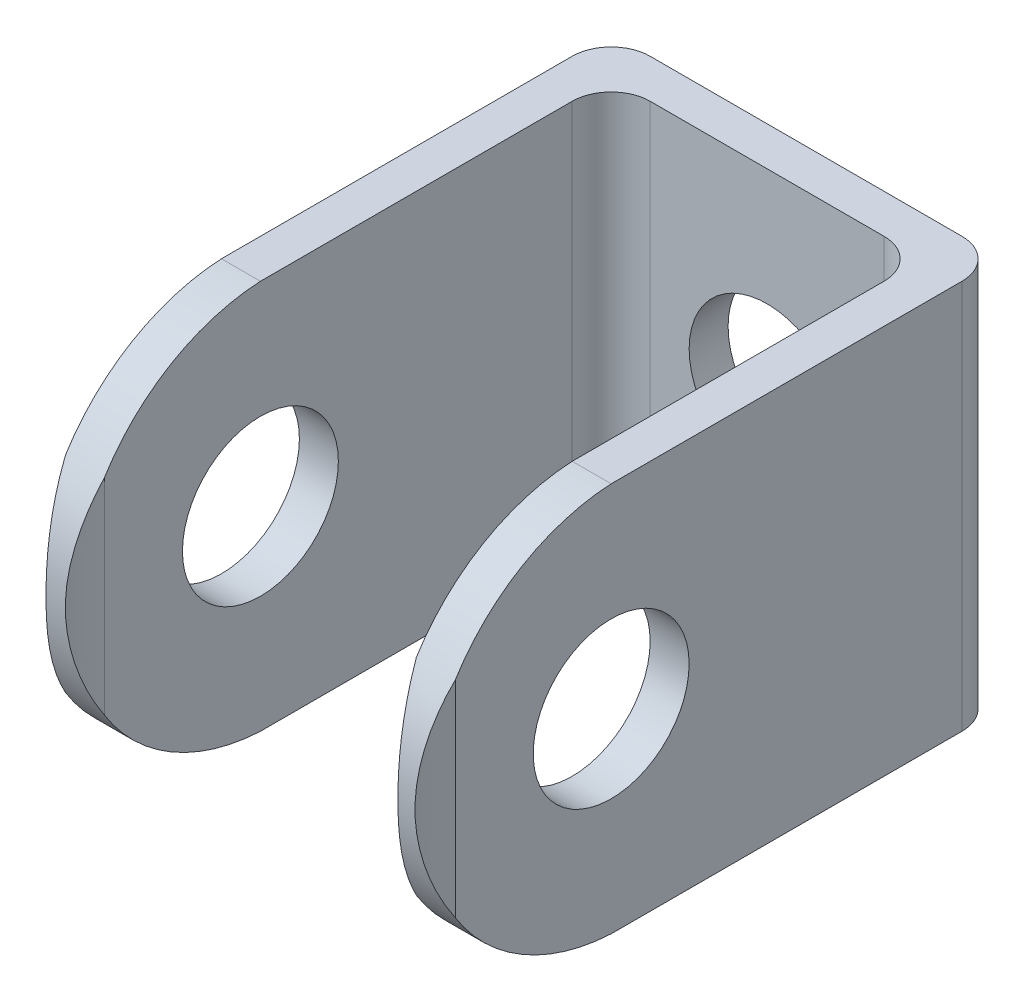
ISO-10303-21;
HEADER;
FILE_DESCRIPTION(('STEP AP214'),'2;1');
FILE_NAME('part.step','',(''),(''),'','','');
FILE_SCHEMA(('AUTOMOTIVE_DESIGN { 1 0 10303 214 1 1 1 1 }'));
ENDSEC;
DATA;
#1=APPLICATION_CONTEXT('core data for automotive mechanical design processes');
#2=APPLICATION_PROTOCOL_DEFINITION('international standard','automotive_design',2000,#1);
#3=PRODUCT_CONTEXT('',#1,'mechanical');
#4=PRODUCT('Part','Part','',(#3));
#5=PRODUCT_RELATED_PRODUCT_CATEGORY('part','',(#4));
#6=PRODUCT_DEFINITION_FORMATION('','',#4);
#7=PRODUCT_DEFINITION_CONTEXT('part definition',#1,'design');
#8=PRODUCT_DEFINITION('design','',#6,#7);
#9=PRODUCT_DEFINITION_SHAPE('','',#8);
#10=(LENGTH_UNIT() NAMED_UNIT(*) SI_UNIT(.MILLI.,.METRE.));
#11=(NAMED_UNIT(*) PLANE_ANGLE_UNIT() SI_UNIT($,.RADIAN.));
#12=(NAMED_UNIT(*) SI_UNIT($,.STERADIAN.) SOLID_ANGLE_UNIT());
#13=UNCERTAINTY_MEASURE_WITH_UNIT(LENGTH_MEASURE(1.E-05),#10,'distance_accuracy_value','');
#14=(GEOMETRIC_REPRESENTATION_CONTEXT(3) GLOBAL_UNCERTAINTY_ASSIGNED_CONTEXT((#13)) GLOBAL_UNIT_ASSIGNED_CONTEXT((#10,
#11,#12)) REPRESENTATION_CONTEXT('',''));
#15=CARTESIAN_POINT('',(0.,0.,0.));
#16=DIRECTION('',(0.,0.,1.));
#17=DIRECTION('',(1.,0.,0.));
#18=AXIS2_PLACEMENT_3D('',#15,#16,#17);
#19=CARTESIAN_POINT('',(0.,10.,-1.));
#20=DIRECTION('',(1.,0.,0.));
#21=DIRECTION('',(0.,0.,-1.));
#22=AXIS2_PLACEMENT_3D('',#19,#20,#21);
#23=PLANE('',#22);
#24=CARTESIAN_POINT('',(0.,5.,-5.));
#25=DIRECTION('',(1.,0.,0.));
#26=DIRECTION('',(0.,0.,-1.));
#27=AXIS2_PLACEMENT_3D('',#24,#25,#26);
#28=CIRCLE('',#27,2.);
#29=CARTESIAN_POINT('',(0.,5.,-7.));
#30=VERTEX_POINT('',#29);
#31=EDGE_CURVE('E276',#30,#30,#28,.T.);
#32=ORIENTED_EDGE('',*,*,#31,.T.);
#33=EDGE_LOOP('',(#32));
#34=FACE_BOUND('',#33,.T.);
#35=CARTESIAN_POINT('',(0.,5.,-5.25270712016013));
#36=DIRECTION('',(-1.,0.,0.));
#37=DIRECTION('',(0.,0.,-1.));
#38=AXIS2_PLACEMENT_3D('',#35,#36,#37);
#39=CIRCLE('',#38,5.00638201584534);
#40=CARTESIAN_POINT('',(0.,7.64165535956509,-1.));
#41=VERTEX_POINT('',#40);
#42=CARTESIAN_POINT('',(0.,10.,-5.));
#43=VERTEX_POINT('',#42);
#44=EDGE_CURVE('E528',#41,#43,#39,.T.);
#45=ORIENTED_EDGE('',*,*,#44,.T.);
#46=DIRECTION('',(0.,0.,1.));
#47=VECTOR('',#46,1.);
#48=CARTESIAN_POINT('',(0.,10.,-1.));
#49=LINE('',#48,#47);
#50=CARTESIAN_POINT('',(0.,10.,-14.));
#51=VERTEX_POINT('',#50);
#52=EDGE_CURVE('E243',#51,#43,#49,.T.);
#53=ORIENTED_EDGE('',*,*,#52,.F.);
#54=DIRECTION('',(0.,-1.,0.));
#55=VECTOR('',#54,1.);
#56=CARTESIAN_POINT('',(0.,10.,-14.));
#57=LINE('',#56,#55);
#58=CARTESIAN_POINT('',(0.,0.,-14.));
#59=VERTEX_POINT('',#58);
#60=EDGE_CURVE('E43',#51,#59,#57,.T.);
#61=ORIENTED_EDGE('',*,*,#60,.T.);
#62=DIRECTION('',(0.,0.,1.));
#63=VECTOR('',#62,1.);
#64=CARTESIAN_POINT('',(0.,0.,-1.));
#65=LINE('',#64,#63);
#66=CARTESIAN_POINT('',(0.,0.,-5.));
#67=VERTEX_POINT('',#66);
#68=EDGE_CURVE('E189',#59,#67,#65,.T.);
#69=ORIENTED_EDGE('',*,*,#68,.T.);
#70=CARTESIAN_POINT('',(0.,2.35834464043492,-1.));
#71=VERTEX_POINT('',#70);
#72=EDGE_CURVE('E49',#67,#71,#39,.T.);
#73=ORIENTED_EDGE('',*,*,#72,.T.);
#74=DIRECTION('',(0.,-1.,0.));
#75=VECTOR('',#74,1.);
#76=CARTESIAN_POINT('',(0.,10.,-1.));
#77=LINE('',#76,#75);
#78=EDGE_CURVE('E237',#41,#71,#77,.T.);
#79=ORIENTED_EDGE('',*,*,#78,.F.);
#80=EDGE_LOOP('',(#45,#53,#61,#69,#73,#79));
#81=FACE_BOUND('',#80,.T.);
#82=ADVANCED_FACE('F35',(#34,#81),#23,.F.);
#83=CARTESIAN_POINT('',(0.,10.,-1.));
#84=CARTESIAN_POINT('',(0.5,10.,1.));
#85=CARTESIAN_POINT('',(1.,10.,-1.));
#86=B_SPLINE_CURVE_WITH_KNOTS('',2,(#83,#84,#85),.UNSPECIFIED.,.F.,.F.,(3,3),(0.,1.),.UNSPECIFIED.);
#87=DIRECTION('',(0.,-1.,0.));
#88=VECTOR('',#87,1.);
#89=SURFACE_OF_LINEAR_EXTRUSION('',#86,#88);
#90=CARTESIAN_POINT('',(1.,2.35834464043492,-1.));
#91=CARTESIAN_POINT('',(0.987586274162019,2.43831458935705,-0.950322111895742));
#92=CARTESIAN_POINT('',(0.97526220686018,2.51969871085131,-0.902897687371668));
#93=CARTESIAN_POINT('',(0.950909560241327,2.68505330524873,-0.812690597561429));
#94=CARTESIAN_POINT('',(0.938881009901104,2.76902402997512,-0.769908386071353));
#95=CARTESIAN_POINT('',(0.915237741969369,2.93929625622261,-0.68912929849157));
#96=CARTESIAN_POINT('',(0.903623034775822,3.02559781621119,-0.651132542577535));
#97=CARTESIAN_POINT('',(0.880945296250552,3.20048578646709,-0.579962389559266));
#98=CARTESIAN_POINT('',(0.869883667380164,3.28907721876767,-0.546800882444792));
#99=CARTESIAN_POINT('',(0.848560733022382,3.46808168730143,-0.485523830491659));
#100=CARTESIAN_POINT('',(0.838299411564471,3.55849468713902,-0.457408184945842));
#101=CARTESIAN_POINT('',(0.818864443326718,3.74088634517616,-0.40632047941103));
#102=CARTESIAN_POINT('',(0.80969087907439,3.83286512156564,-0.383348809575192));
#103=CARTESIAN_POINT('',(0.792769468169625,4.01844314579956,-0.342568127302876));
#104=CARTESIAN_POINT('',(0.785026889032049,4.11204704558949,-0.324778055441356));
#105=CARTESIAN_POINT('',(0.771449026686045,4.3002503571925,-0.294552834169206));
#106=CARTESIAN_POINT('',(0.765613636911224,4.39484971307834,-0.282117385550528));
#107=CARTESIAN_POINT('',(0.756298406536368,4.5847111707129,-0.262666976857746));
#108=CARTESIAN_POINT('',(0.752818273616,4.67997318873273,-0.255651344093358));
#109=CARTESIAN_POINT('',(0.748550151969589,4.87062319770969,-0.24708925463976));
#110=CARTESIAN_POINT('',(0.747757060600068,4.96601060539817,-0.245532431572667));
#111=CARTESIAN_POINT('',(0.74893314325245,5.15671187256153,-0.247869885677402));
#112=CARTESIAN_POINT('',(0.750902599902179,5.25202572351284,-0.251764720591574));
#113=CARTESIAN_POINT('',(0.757400491763793,5.44217287903341,-0.264979345267603));
#114=CARTESIAN_POINT('',(0.761928698372819,5.53700622576814,-0.274298650400756));
#115=CARTESIAN_POINT('',(0.775138834278926,5.75941575422807,-0.302577219793258));
#116=CARTESIAN_POINT('',(0.784724842330766,5.88665783313591,-0.323784766107827));
#117=CARTESIAN_POINT('',(0.806743173198777,6.13887924181868,-0.375884060798925));
#118=CARTESIAN_POINT('',(0.819175595271706,6.26385849252294,-0.406776146897056));
#119=CARTESIAN_POINT('',(0.84595780153479,6.51090616679192,-0.478028723938261));
#120=CARTESIAN_POINT('',(0.860308034297877,6.63297390146175,-0.518391431719195));
#121=CARTESIAN_POINT('',(0.890258242339486,6.8734705719259,-0.60830803992053));
#122=CARTESIAN_POINT('',(0.905857769047064,6.99190079285999,-0.65785864966797));
#123=CARTESIAN_POINT('',(0.934496872752524,7.20008001686902,-0.754510719387574));
#124=CARTESIAN_POINT('',(0.947386209037705,7.29062987784011,-0.799941820217933));
#125=CARTESIAN_POINT('',(0.973483434302868,7.46853983203453,-0.896059995631951));
#126=CARTESIAN_POINT('',(0.98669041018551,7.55590759051254,-0.946733129931079));
#127=CARTESIAN_POINT('',(1.,7.64165535956509,-1.));
#128=B_SPLINE_CURVE_WITH_KNOTS('',3,(#90,#91,#92,#93,#94,#95,#96,#97,#98,#99,#100,#101,#102,
#103,#104,#105,#106,#107,#108,#109,#110,#111,#112,#113,#114,#115,#116,#117,#118,#119,#120,#121,
#122,#123,#124,#125,#126,#127),.UNSPECIFIED.,.F.,.F.,(4,2,2,2,2,2,2,2,2,2,2,2,2,2,2,2,2,2,4),
(0.,0.284840000015192,0.569707819315872,0.854582790988555,1.14014687205804,1.42570525310077,
1.71128528545029,1.99789647677256,2.28449165062674,2.57105124748315,2.85706636690137,
3.14311074978474,3.42912958104003,3.81673829616192,4.20436052957201,4.59207358641683,
4.97964805001559,5.28584245802683,5.59124256483714),.UNSPECIFIED.);
#129=CARTESIAN_POINT('',(0.999999999999999,2.35834464043492,-1.));
#130=VERTEX_POINT('',#129);
#131=CARTESIAN_POINT('',(1.,7.64165535956509,-1.));
#132=VERTEX_POINT('',#131);
#133=EDGE_CURVE('E264',#130,#132,#128,.T.);
#134=ORIENTED_EDGE('',*,*,#133,.F.);
#135=DIRECTION('',(0.,-1.,0.));
#136=VECTOR('',#135,1.);
#137=CARTESIAN_POINT('',(1.,10.,-1.));
#138=LINE('',#137,#136);
#139=EDGE_CURVE('E234',#132,#130,#138,.T.);
#140=ORIENTED_EDGE('',*,*,#139,.F.);
#141=EDGE_LOOP('',(#134,#140));
#142=FACE_BOUND('',#141,.T.);
#143=ADVANCED_FACE('F287',(#142),#89,.F.);
#144=CARTESIAN_POINT('',(0.,7.64165535956509,-1.));
#145=CARTESIAN_POINT('',(0.0174758504321065,7.52897462954846,-0.92999483277384));
#146=CARTESIAN_POINT('',(0.0347979089672472,7.41348339638327,-0.864472889642039));
#147=CARTESIAN_POINT('',(0.0687550470780124,7.17757778399538,-0.742761717226969));
#148=CARTESIAN_POINT('',(0.0853900832911223,7.05716309497251,-0.686573076355692));
#149=CARTESIAN_POINT('',(0.117638389231058,6.811765872904,-0.583754137429377));
#150=CARTESIAN_POINT('',(0.13324854105478,6.68677105434225,-0.537152162620388));
#151=CARTESIAN_POINT('',(0.162772050111876,6.43327325811609,-0.454021853565034));
#152=CARTESIAN_POINT('',(0.176685368491896,6.30477020020395,-0.41749374996164));
#153=CARTESIAN_POINT('',(0.201947136098176,6.04467426844658,-0.354701374428023));
#154=CARTESIAN_POINT('',(0.213288943408314,5.91307434097846,-0.328463556516062));
#155=CARTESIAN_POINT('',(0.232148534704665,5.6479240537697,-0.286615625444892));
#156=CARTESIAN_POINT('',(0.239666679155798,5.51437387910458,-0.271004510436576));
#157=CARTESIAN_POINT('',(0.249646387807947,5.24650910930651,-0.250597796879298));
#158=CARTESIAN_POINT('',(0.252117684099969,5.11219648719407,-0.245781380617796));
#159=CARTESIAN_POINT('',(0.25152174774367,4.8436350945707,-0.246966246597576));
#160=CARTESIAN_POINT('',(0.248454685293091,4.70938632222443,-0.25296719641342));
#161=CARTESIAN_POINT('',(0.23759382373607,4.44652124524776,-0.275324636063367));
#162=CARTESIAN_POINT('',(0.229962527058921,4.31786740363235,-0.291325921846913));
#163=CARTESIAN_POINT('',(0.211233339955138,4.06242461079572,-0.333198196805216));
#164=CARTESIAN_POINT('',(0.200134988295525,3.93563591005116,-0.35907049925306));
#165=CARTESIAN_POINT('',(0.175534548430862,3.68454589905597,-0.420506556153358));
#166=CARTESIAN_POINT('',(0.162030207128403,3.56024704286277,-0.456079411434655));
#167=CARTESIAN_POINT('',(0.133439036044689,3.31497642745292,-0.536647764022859));
#168=CARTESIAN_POINT('',(0.118352697979532,3.19400364909409,-0.581640337801096));
#169=CARTESIAN_POINT('',(0.0864479606723273,2.95056283488726,-0.683042876755161));
#170=CARTESIAN_POINT('',(0.0695819140810538,2.82827911132664,-0.739880646446639));
#171=CARTESIAN_POINT('',(0.0351940743437944,2.58916354900277,-0.862971502357399));
#172=CARTESIAN_POINT('',(0.0176746427460434,2.47231496651332,-0.92919272153698));
#173=CARTESIAN_POINT('',(0.,2.35834464043495,-1.));
#174=B_SPLINE_CURVE_WITH_KNOTS('',3,(#144,#145,#146,#147,#148,#149,#150,#151,#152,#153,#154,
#155,#156,#157,#158,#159,#160,#161,#162,#163,#164,#165,#166,#167,#168,#169,#170,#171,#172,#173),
.UNSPECIFIED.,.F.,.F.,(4,2,2,2,2,2,2,2,2,2,2,2,2,2,4),(0.,0.401305297538484,0.80263588551478,
1.20513567131885,1.60764467165813,2.01118175402821,2.41468078703513,2.8174009950412,
3.22010882737667,3.60926759529164,3.9984781562561,4.3880551291179,4.77751137060906,
5.1847655634358,5.59066843339274),.UNSPECIFIED.);
#175=EDGE_CURVE('E270',#41,#71,#174,.T.);
#176=ORIENTED_EDGE('',*,*,#175,.F.);
#177=ORIENTED_EDGE('',*,*,#78,.T.);
#178=EDGE_LOOP('',(#176,#177));
#179=FACE_BOUND('',#178,.T.);
#180=ADVANCED_FACE('F336',(#179),#89,.F.);
#181=CARTESIAN_POINT('',(1.,10.,-1.));
#182=DIRECTION('',(-1.,0.,0.));
#183=DIRECTION('',(0.,0.,1.));
#184=AXIS2_PLACEMENT_3D('',#181,#182,#183);
#185=PLANE('',#184);
#186=CARTESIAN_POINT('',(1.,5.,-5.));
#187=DIRECTION('',(-1.,0.,0.));
#188=DIRECTION('',(0.,0.,1.));
#189=AXIS2_PLACEMENT_3D('',#186,#187,#188);
#190=CIRCLE('',#189,2.);
#191=CARTESIAN_POINT('',(1.,5.,-3.));
#192=VERTEX_POINT('',#191);
#193=EDGE_CURVE('E190',#192,#192,#190,.T.);
#194=ORIENTED_EDGE('',*,*,#193,.T.);
#195=EDGE_LOOP('',(#194));
#196=FACE_BOUND('',#195,.T.);
#197=CARTESIAN_POINT('',(0.999999999999999,5.,-5.25270712016013));
#198=DIRECTION('',(-1.,0.,0.));
#199=DIRECTION('',(0.,0.,1.));
#200=AXIS2_PLACEMENT_3D('',#197,#198,#199);
#201=CIRCLE('',#200,5.00638201584534);
#202=CARTESIAN_POINT('',(0.999999999999999,10.,-5.));
#203=VERTEX_POINT('',#202);
#204=EDGE_CURVE('E266',#132,#203,#201,.T.);
#205=ORIENTED_EDGE('',*,*,#204,.F.);
#206=ORIENTED_EDGE('',*,*,#139,.T.);
#207=CARTESIAN_POINT('',(0.999999999999999,0.,-5.));
#208=VERTEX_POINT('',#207);
#209=EDGE_CURVE('E257',#208,#130,#201,.T.);
#210=ORIENTED_EDGE('',*,*,#209,.F.);
#211=DIRECTION('',(0.,0.,-1.));
#212=VECTOR('',#211,1.);
#213=CARTESIAN_POINT('',(1.,0.,-1.));
#214=LINE('',#213,#212);
#215=CARTESIAN_POINT('',(1.,0.,-13.));
#216=VERTEX_POINT('',#215);
#217=EDGE_CURVE('E193',#208,#216,#214,.T.);
#218=ORIENTED_EDGE('',*,*,#217,.T.);
#219=DIRECTION('',(0.,-1.,0.));
#220=VECTOR('',#219,1.);
#221=CARTESIAN_POINT('',(1.,10.,-13.));
#222=LINE('',#221,#220);
#223=CARTESIAN_POINT('',(1.,10.,-13.));
#224=VERTEX_POINT('',#223);
#225=EDGE_CURVE('E231',#224,#216,#222,.T.);
#226=ORIENTED_EDGE('',*,*,#225,.F.);
#227=DIRECTION('',(0.,0.,-1.));
#228=VECTOR('',#227,1.);
#229=CARTESIAN_POINT('',(1.,10.,-1.));
#230=LINE('',#229,#228);
#231=EDGE_CURVE('E359',#203,#224,#230,.T.);
#232=ORIENTED_EDGE('',*,*,#231,.F.);
#233=EDGE_LOOP('',(#205,#206,#210,#218,#226,#232));
#234=FACE_BOUND('',#233,.T.);
#235=ADVANCED_FACE('F261',(#196,#234),#185,.F.);
#236=CARTESIAN_POINT('',(9.,10.,-1.));
#237=DIRECTION('',(1.,0.,0.));
#238=DIRECTION('',(0.,0.,-1.));
#239=AXIS2_PLACEMENT_3D('',#236,#237,#238);
#240=PLANE('',#239);
#241=CARTESIAN_POINT('',(9.,5.,-5.));
#242=DIRECTION('',(1.,0.,0.));
#243=DIRECTION('',(0.,0.,-1.));
#244=AXIS2_PLACEMENT_3D('',#241,#242,#243);
#245=CIRCLE('',#244,2.);
#246=CARTESIAN_POINT('',(9.,5.,-7.));
#247=VERTEX_POINT('',#246);
#248=EDGE_CURVE('E352',#247,#247,#245,.T.);
#249=ORIENTED_EDGE('',*,*,#248,.T.);
#250=EDGE_LOOP('',(#249));
#251=FACE_BOUND('',#250,.T.);
#252=CARTESIAN_POINT('',(9.,5.,-5.25270712016013));
#253=DIRECTION('',(1.,0.,0.));
#254=DIRECTION('',(0.,0.,-1.));
#255=AXIS2_PLACEMENT_3D('',#252,#253,#254);
#256=CIRCLE('',#255,5.00638201584534);
#257=CARTESIAN_POINT('',(9.,10.,-5.));
#258=VERTEX_POINT('',#257);
#259=CARTESIAN_POINT('',(9.,7.64165535956509,-1.));
#260=VERTEX_POINT('',#259);
#261=EDGE_CURVE('E268',#258,#260,#256,.T.);
#262=ORIENTED_EDGE('',*,*,#261,.F.);
#263=DIRECTION('',(0.,0.,1.));
#264=VECTOR('',#263,1.);
#265=CARTESIAN_POINT('',(9.,10.,-1.));
#266=LINE('',#265,#264);
#267=CARTESIAN_POINT('',(9.,10.,-13.));
#268=VERTEX_POINT('',#267);
#269=EDGE_CURVE('E165',#268,#258,#266,.T.);
#270=ORIENTED_EDGE('',*,*,#269,.F.);
#271=DIRECTION('',(0.,-1.,0.));
#272=VECTOR('',#271,1.);
#273=CARTESIAN_POINT('',(9.,10.,-13.));
#274=LINE('',#273,#272);
#275=CARTESIAN_POINT('',(9.,0.,-13.));
#276=VERTEX_POINT('',#275);
#277=EDGE_CURVE('E222',#268,#276,#274,.T.);
#278=ORIENTED_EDGE('',*,*,#277,.T.);
#279=DIRECTION('',(0.,0.,1.));
#280=VECTOR('',#279,1.);
#281=CARTESIAN_POINT('',(9.,0.,-1.));
#282=LINE('',#281,#280);
#283=CARTESIAN_POINT('',(9.,0.,-5.00000000000001));
#284=VERTEX_POINT('',#283);
#285=EDGE_CURVE('E201',#276,#284,#282,.T.);
#286=ORIENTED_EDGE('',*,*,#285,.T.);
#287=CARTESIAN_POINT('',(9.,2.35834464043492,-1.));
#288=VERTEX_POINT('',#287);
#289=EDGE_CURVE('E57',#288,#284,#256,.T.);
#290=ORIENTED_EDGE('',*,*,#289,.F.);
#291=DIRECTION('',(0.,-1.,0.));
#292=VECTOR('',#291,1.);
#293=CARTESIAN_POINT('',(9.,10.,-1.));
#294=LINE('',#293,#292);
#295=EDGE_CURVE('E219',#260,#288,#294,.T.);
#296=ORIENTED_EDGE('',*,*,#295,.F.);
#297=EDGE_LOOP('',(#262,#270,#278,#286,#290,#296));
#298=FACE_BOUND('',#297,.T.);
#299=ADVANCED_FACE('F316',(#251,#298),#240,.F.);
#300=CARTESIAN_POINT('',(9.,10.,-1.));
#301=CARTESIAN_POINT('',(9.16666666666667,10.,-0.5));
#302=CARTESIAN_POINT('',(9.5,10.,0.5));
#303=CARTESIAN_POINT('',(9.83333333333333,10.,-0.5));
#304=CARTESIAN_POINT('',(10.,10.,-0.999999999999999));
#305=B_SPLINE_CURVE_WITH_KNOTS('',3,(#300,#301,#302,#303,#304),.UNSPECIFIED.,.F.,.F.,(4,1,4),
(0.,0.5,1.),.UNSPECIFIED.);
#306=DIRECTION('',(0.,-1.,0.));
#307=VECTOR('',#306,1.);
#308=SURFACE_OF_LINEAR_EXTRUSION('',#305,#307);
#309=CARTESIAN_POINT('',(10.,2.35834464043492,-0.999999999999999));
#310=CARTESIAN_POINT('',(9.98787923099772,2.41690818064865,-0.963621661326934));
#311=CARTESIAN_POINT('',(9.97614029308333,2.47627311993024,-0.928423087521077));
#312=CARTESIAN_POINT('',(9.95336963821113,2.59650908146531,-0.860456960843044));
#313=CARTESIAN_POINT('',(9.94233790324357,2.65738006531088,-0.827689346060343));
#314=CARTESIAN_POINT('',(9.91022013167717,2.84209901297062,-0.733143900276915));
#315=CARTESIAN_POINT('',(9.89010908205598,2.96806494349525,-0.675116027386219));
#316=CARTESIAN_POINT('',(9.85240964866908,3.22493482271057,-0.569510294364166));
#317=CARTESIAN_POINT('',(9.83482609894185,3.35584764461048,-0.521952368887605));
#318=CARTESIAN_POINT('',(9.80253819606397,3.62151562473543,-0.437828799249228));
#319=CARTESIAN_POINT('',(9.78783387408702,3.7562708245442,-0.401263274100991));
#320=CARTESIAN_POINT('',(9.76196336242892,4.02909003186612,-0.339376663643029));
#321=CARTESIAN_POINT('',(9.75080743597871,4.16716241706342,-0.314088112085263));
#322=CARTESIAN_POINT('',(9.73313712366462,4.44523214158761,-0.275177949902937));
#323=CARTESIAN_POINT('',(9.72662218011713,4.585229247569,-0.261554937449356));
#324=CARTESIAN_POINT('',(9.71922319280583,4.86581380375883,-0.246155072551498));
#325=CARTESIAN_POINT('',(9.71833050085099,5.00640001426604,-0.244360026041475));
#326=CARTESIAN_POINT('',(9.72231886730926,5.28713858476374,-0.25259386089784));
#327=CARTESIAN_POINT('',(9.72719981003163,5.42729095339103,-0.26262250534385));
#328=CARTESIAN_POINT('',(9.74134469478379,5.69499673596376,-0.293116620673307));
#329=CARTESIAN_POINT('',(9.75023299610458,5.82267276739129,-0.312697508292961));
#330=CARTESIAN_POINT('',(9.77136751477983,6.07586832841988,-0.36159343599508));
#331=CARTESIAN_POINT('',(9.78361394186198,6.20138772281032,-0.390909084074396));
#332=CARTESIAN_POINT('',(9.81079549864724,6.44954487298877,-0.459040386080926));
#333=CARTESIAN_POINT('',(9.82573118363107,6.57218202772558,-0.497858002580516));
#334=CARTESIAN_POINT('',(9.85789322722681,6.81380257404271,-0.584682375007216));
#335=CARTESIAN_POINT('',(9.87511879296825,6.93278721283137,-0.632685952815334));
#336=CARTESIAN_POINT('',(9.90947105588917,7.15204620916624,-0.731074746605307));
#337=CARTESIAN_POINT('',(9.9263485599566,7.252819900767,-0.780438209340873));
#338=CARTESIAN_POINT('',(9.9618374891037,7.45030932080515,-0.885517955734431));
#339=CARTESIAN_POINT('',(9.98044390188936,7.54703566920835,-0.94121597386152));
#340=CARTESIAN_POINT('',(10.,7.64165535956508,-0.999999999999999));
#341=B_SPLINE_CURVE_WITH_KNOTS('',3,(#309,#310,#311,#312,#313,#314,#315,#316,#317,#318,#319,
#320,#321,#322,#323,#324,#325,#326,#327,#328,#329,#330,#331,#332,#333,#334,#335,#336,#337,#338,
#339,#340),.UNSPECIFIED.,.F.,.F.,(4,2,2,2,2,2,2,2,2,2,2,2,2,2,2,4),(0.,0.20996675276005,
0.419928156348303,0.839808184788846,1.2604808754045,1.68115812043579,2.10304127765799,
2.52487373074432,2.94605715908027,3.36723214798373,3.75522243542563,4.14323695985377,
4.53133169398665,4.91929239875895,5.25946383703707,5.59867814557471),.UNSPECIFIED.);
#342=CARTESIAN_POINT('',(10.,2.35834464043492,-0.999999999999999));
#343=VERTEX_POINT('',#342);
#344=CARTESIAN_POINT('',(10.,7.64165535956508,-0.999999999999999));
#345=VERTEX_POINT('',#344);
#346=EDGE_CURVE('E151',#343,#345,#341,.T.);
#347=ORIENTED_EDGE('',*,*,#346,.F.);
#348=DIRECTION('',(0.,-1.,0.));
#349=VECTOR('',#348,1.);
#350=CARTESIAN_POINT('',(10.,10.,-0.999999999999999));
#351=LINE('',#350,#349);
#352=EDGE_CURVE('E217',#345,#343,#351,.T.);
#353=ORIENTED_EDGE('',*,*,#352,.F.);
#354=EDGE_LOOP('',(#347,#353));
#355=FACE_BOUND('',#354,.T.);
#356=ADVANCED_FACE('F310',(#355),#308,.F.);
#357=CARTESIAN_POINT('',(9.,7.64165535956509,-1.));
#358=CARTESIAN_POINT('',(9.01212720153488,7.58306070249913,-0.963602331693849));
#359=CARTESIAN_POINT('',(9.02387217556277,7.52366379958083,-0.928385686389957));
#360=CARTESIAN_POINT('',(9.04665418032384,7.40336236912503,-0.860386041625861));
#361=CARTESIAN_POINT('',(9.05769122909495,7.34245788005566,-0.827602980154602));
#362=CARTESIAN_POINT('',(9.08982396755441,7.15763631541806,-0.733015284844012));
#363=CARTESIAN_POINT('',(9.10994369335497,7.0315991834111,-0.674964706846292));
#364=CARTESIAN_POINT('',(9.14765757163875,6.77458333693556,-0.569325504806985));
#365=CARTESIAN_POINT('',(9.1652468971884,6.64359576445751,-0.521756786210551));
#366=CARTESIAN_POINT('',(9.19754255768312,6.37777566346728,-0.437623814488435));
#367=CARTESIAN_POINT('',(9.21224886145937,6.24294309340426,-0.401059680332822));
#368=CARTESIAN_POINT('',(9.23811781987796,5.96996672708274,-0.339188209943324));
#369=CARTESIAN_POINT('',(9.24927016608275,5.83181452630058,-0.313913535719137));
#370=CARTESIAN_POINT('',(9.26692535938485,5.55358590724917,-0.275044220845064));
#371=CARTESIAN_POINT('',(9.27342876626495,5.41350972271935,-0.261448173921851));
#372=CARTESIAN_POINT('',(9.28079640553602,5.13277012215521,-0.246115200359219));
#373=CARTESIAN_POINT('',(9.28166929925688,4.99210794128904,-0.244360058850161));
#374=CARTESIAN_POINT('',(9.2776365488373,4.71122244969438,-0.252686147799273));
#375=CARTESIAN_POINT('',(9.27273101916092,4.57099913032771,-0.262767143796893));
#376=CARTESIAN_POINT('',(9.25854197897718,4.30323466957791,-0.293364875621049));
#377=CARTESIAN_POINT('',(9.24963650545924,4.17556965173678,-0.312990628643275));
#378=CARTESIAN_POINT('',(9.2284714525547,3.92239958716226,-0.36197486616725));
#379=CARTESIAN_POINT('',(9.21621166594203,3.79689467438733,-0.391333952008191));
#380=CARTESIAN_POINT('',(9.18900601965506,3.54877036244343,-0.45955029153732));
#381=CARTESIAN_POINT('',(9.17405962031777,3.42615154861532,-0.498409454082569));
#382=CARTESIAN_POINT('',(9.14187746731942,3.18457066099244,-0.585314936960571));
#383=CARTESIAN_POINT('',(9.12464250723329,3.06560733715913,-0.63335807521075));
#384=CARTESIAN_POINT('',(9.09031363458414,2.84665263066941,-0.731701463410296));
#385=CARTESIAN_POINT('',(9.07347313472228,2.74615308541648,-0.780962920175133));
#386=CARTESIAN_POINT('',(9.03806681884981,2.54919235865131,-0.8858049843709));
#387=CARTESIAN_POINT('',(9.0195059803081,2.45272062984637,-0.941367459220969));
#388=CARTESIAN_POINT('',(9.,2.35834464043492,-1.));
#389=B_SPLINE_CURVE_WITH_KNOTS('',3,(#357,#358,#359,#360,#361,#362,#363,#364,#365,#366,#367,
#368,#369,#370,#371,#372,#373,#374,#375,#376,#377,#378,#379,#380,#381,#382,#383,#384,#385,#386,
#387,#388),.UNSPECIFIED.,.F.,.F.,(4,2,2,2,2,2,2,2,2,2,2,2,2,2,2,4),(0.,0.210078277245242,
0.420151199568992,0.840254307009772,1.26114845902642,1.68204716114739,2.10415581821119,
2.52621364024301,2.94762206221794,3.36902213670753,3.7570039809837,4.14500979980018,
4.53309364506629,4.92104326917496,5.26033681551124,5.59867762629452),.UNSPECIFIED.);
#390=EDGE_CURVE('E166',#260,#288,#389,.T.);
#391=ORIENTED_EDGE('',*,*,#390,.F.);
#392=ORIENTED_EDGE('',*,*,#295,.T.);
#393=EDGE_LOOP('',(#391,#392));
#394=FACE_BOUND('',#393,.T.);
#395=ADVANCED_FACE('F315',(#394),#308,.F.);
#396=CARTESIAN_POINT('',(10.,10.,-14.));
#397=DIRECTION('',(-1.,0.,0.));
#398=DIRECTION('',(0.,0.,1.));
#399=AXIS2_PLACEMENT_3D('',#396,#397,#398);
#400=PLANE('',#399);
#401=CARTESIAN_POINT('',(10.,5.,-5.));
#402=DIRECTION('',(1.,0.,0.));
#403=DIRECTION('',(0.,0.,-1.));
#404=AXIS2_PLACEMENT_3D('',#401,#402,#403);
#405=CIRCLE('',#404,2.);
#406=CARTESIAN_POINT('',(10.,5.,-7.));
#407=VERTEX_POINT('',#406);
#408=EDGE_CURVE('E272',#407,#407,#405,.T.);
#409=ORIENTED_EDGE('',*,*,#408,.F.);
#410=EDGE_LOOP('',(#409));
#411=FACE_BOUND('',#410,.T.);
#412=CARTESIAN_POINT('',(10.,5.,-5.25270712016013));
#413=DIRECTION('',(-1.,0.,0.));
#414=DIRECTION('',(0.,0.,-1.));
#415=AXIS2_PLACEMENT_3D('',#412,#413,#414);
#416=CIRCLE('',#415,5.00638201584534);
#417=CARTESIAN_POINT('',(10.,10.,-5.));
#418=VERTEX_POINT('',#417);
#419=EDGE_CURVE('E145',#345,#418,#416,.T.);
#420=ORIENTED_EDGE('',*,*,#419,.F.);
#421=ORIENTED_EDGE('',*,*,#352,.T.);
#422=CARTESIAN_POINT('',(10.,0.,-5.));
#423=VERTEX_POINT('',#422);
#424=EDGE_CURVE('E156',#423,#343,#416,.T.);
#425=ORIENTED_EDGE('',*,*,#424,.F.);
#426=DIRECTION('',(0.,0.,-1.));
#427=VECTOR('',#426,1.);
#428=CARTESIAN_POINT('',(10.,0.,-14.));
#429=LINE('',#428,#427);
#430=CARTESIAN_POINT('',(10.,0.,-14.));
#431=VERTEX_POINT('',#430);
#432=EDGE_CURVE('E204',#423,#431,#429,.T.);
#433=ORIENTED_EDGE('',*,*,#432,.T.);
#434=DIRECTION('',(0.,-1.,0.));
#435=VECTOR('',#434,1.);
#436=CARTESIAN_POINT('',(10.,10.,-14.));
#437=LINE('',#436,#435);
#438=CARTESIAN_POINT('',(10.,10.,-14.));
#439=VERTEX_POINT('',#438);
#440=EDGE_CURVE('E171',#439,#431,#437,.T.);
#441=ORIENTED_EDGE('',*,*,#440,.F.);
#442=DIRECTION('',(0.,0.,-1.));
#443=VECTOR('',#442,1.);
#444=CARTESIAN_POINT('',(10.,10.,-14.));
#445=LINE('',#444,#443);
#446=EDGE_CURVE('E162',#418,#439,#445,.T.);
#447=ORIENTED_EDGE('',*,*,#446,.F.);
#448=EDGE_LOOP('',(#420,#421,#425,#433,#441,#447));
#449=FACE_BOUND('',#448,.T.);
#450=ADVANCED_FACE('F169',(#411,#449),#400,.F.);
#451=CARTESIAN_POINT('',(1.,10.,-14.));
#452=DIRECTION('',(0.,1.,0.));
#453=DIRECTION('',(0.,0.,1.));
#454=AXIS2_PLACEMENT_3D('',#451,#452,#453);
#455=PLANE('',#454);
#456=ORIENTED_EDGE('',*,*,#52,.T.);
#457=DIRECTION('',(-1.,0.,0.));
#458=VECTOR('',#457,1.);
#459=CARTESIAN_POINT('',(10.,10.,-5.));
#460=LINE('',#459,#458);
#461=EDGE_CURVE('E167',#203,#43,#460,.T.);
#462=ORIENTED_EDGE('',*,*,#461,.F.);
#463=ORIENTED_EDGE('',*,*,#231,.T.);
#464=CARTESIAN_POINT('',(2.,10.,-13.));
#465=DIRECTION('',(0.,-1.,0.));
#466=DIRECTION('',(0.,0.,-1.));
#467=AXIS2_PLACEMENT_3D('',#464,#465,#466);
#468=CIRCLE('',#467,0.999999999999997);
#469=CARTESIAN_POINT('',(2.,10.,-14.));
#470=VERTEX_POINT('',#469);
#471=EDGE_CURVE('E368',#224,#470,#468,.T.);
#472=ORIENTED_EDGE('',*,*,#471,.T.);
#473=DIRECTION('',(1.,0.,0.));
#474=VECTOR('',#473,1.);
#475=CARTESIAN_POINT('',(2.,10.,-14.));
#476=LINE('',#475,#474);
#477=CARTESIAN_POINT('',(8.,10.,-14.));
#478=VERTEX_POINT('',#477);
#479=EDGE_CURVE('E370',#470,#478,#476,.T.);
#480=ORIENTED_EDGE('',*,*,#479,.T.);
#481=CARTESIAN_POINT('',(8.,10.,-13.));
#482=DIRECTION('',(0.,-1.,0.));
#483=DIRECTION('',(0.,0.,-1.));
#484=AXIS2_PLACEMENT_3D('',#481,#482,#483);
#485=CIRCLE('',#484,0.999999999999999);
#486=EDGE_CURVE('E177',#478,#268,#485,.T.);
#487=ORIENTED_EDGE('',*,*,#486,.T.);
#488=ORIENTED_EDGE('',*,*,#269,.T.);
#489=EDGE_CURVE('E148',#418,#258,#460,.T.);
#490=ORIENTED_EDGE('',*,*,#489,.F.);
#491=ORIENTED_EDGE('',*,*,#446,.T.);
#492=CARTESIAN_POINT('',(8.99999999999999,10.,-14.));
#493=DIRECTION('',(0.,1.,0.));
#494=DIRECTION('',(0.,0.,-1.));
#495=AXIS2_PLACEMENT_3D('',#492,#493,#494);
#496=CIRCLE('',#495,1.);
#497=CARTESIAN_POINT('',(8.99999999999999,10.,-15.));
#498=VERTEX_POINT('',#497);
#499=EDGE_CURVE('E173',#439,#498,#496,.T.);
#500=ORIENTED_EDGE('',*,*,#499,.T.);
#501=DIRECTION('',(-1.,0.,0.));
#502=VECTOR('',#501,1.);
#503=CARTESIAN_POINT('',(1.,10.,-15.));
#504=LINE('',#503,#502);
#505=CARTESIAN_POINT('',(1.,10.,-15.));
#506=VERTEX_POINT('',#505);
#507=EDGE_CURVE('E175',#498,#506,#504,.T.);
#508=ORIENTED_EDGE('',*,*,#507,.T.);
#509=CARTESIAN_POINT('',(1.,10.,-14.));
#510=DIRECTION('',(0.,1.,0.));
#511=DIRECTION('',(0.,0.,1.));
#512=AXIS2_PLACEMENT_3D('',#509,#510,#511);
#513=CIRCLE('',#512,1.);
#514=EDGE_CURVE('E210',#506,#51,#513,.T.);
#515=ORIENTED_EDGE('',*,*,#514,.T.);
#516=EDGE_LOOP('',(#456,#462,#463,#472,#480,#487,#488,#490,#491,#500,#508,#515));
#517=FACE_BOUND('',#516,.T.);
#518=ADVANCED_FACE('F161',(#517),#455,.T.);
#519=CARTESIAN_POINT('',(1.,0.,-14.));
#520=DIRECTION('',(0.,1.,0.));
#521=DIRECTION('',(0.,0.,1.));
#522=AXIS2_PLACEMENT_3D('',#519,#520,#521);
#523=PLANE('',#522);
#524=DIRECTION('',(-1.,0.,0.));
#525=VECTOR('',#524,1.);
#526=CARTESIAN_POINT('',(10.,0.,-5.00000000000001));
#527=LINE('',#526,#525);
#528=EDGE_CURVE('E11',#67,#208,#527,.F.);
#529=ORIENTED_EDGE('',*,*,#528,.F.);
#530=ORIENTED_EDGE('',*,*,#68,.F.);
#531=CARTESIAN_POINT('',(1.,0.,-14.));
#532=DIRECTION('',(0.,1.,0.));
#533=DIRECTION('',(0.,0.,1.));
#534=AXIS2_PLACEMENT_3D('',#531,#532,#533);
#535=CIRCLE('',#534,1.);
#536=CARTESIAN_POINT('',(1.,0.,-15.));
#537=VERTEX_POINT('',#536);
#538=EDGE_CURVE('E186',#537,#59,#535,.T.);
#539=ORIENTED_EDGE('',*,*,#538,.F.);
#540=DIRECTION('',(-1.,0.,0.));
#541=VECTOR('',#540,1.);
#542=CARTESIAN_POINT('',(1.,0.,-15.));
#543=LINE('',#542,#541);
#544=CARTESIAN_POINT('',(8.99999999999999,0.,-15.));
#545=VERTEX_POINT('',#544);
#546=EDGE_CURVE('E208',#545,#537,#543,.T.);
#547=ORIENTED_EDGE('',*,*,#546,.F.);
#548=CARTESIAN_POINT('',(8.99999999999999,0.,-14.));
#549=DIRECTION('',(0.,1.,0.));
#550=DIRECTION('',(0.,0.,-1.));
#551=AXIS2_PLACEMENT_3D('',#548,#549,#550);
#552=CIRCLE('',#551,1.);
#553=EDGE_CURVE('E206',#431,#545,#552,.T.);
#554=ORIENTED_EDGE('',*,*,#553,.F.);
#555=ORIENTED_EDGE('',*,*,#432,.F.);
#556=DIRECTION('',(-1.,0.,0.));
#557=VECTOR('',#556,1.);
#558=CARTESIAN_POINT('',(10.,0.,-5.));
#559=LINE('',#558,#557);
#560=EDGE_CURVE('E532',#423,#284,#559,.T.);
#561=ORIENTED_EDGE('',*,*,#560,.T.);
#562=ORIENTED_EDGE('',*,*,#285,.F.);
#563=CARTESIAN_POINT('',(8.,0.,-13.));
#564=DIRECTION('',(0.,-1.,0.));
#565=DIRECTION('',(0.,0.,-1.));
#566=AXIS2_PLACEMENT_3D('',#563,#564,#565);
#567=CIRCLE('',#566,0.999999999999999);
#568=CARTESIAN_POINT('',(8.,0.,-14.));
#569=VERTEX_POINT('',#568);
#570=EDGE_CURVE('E199',#569,#276,#567,.T.);
#571=ORIENTED_EDGE('',*,*,#570,.F.);
#572=DIRECTION('',(1.,0.,0.));
#573=VECTOR('',#572,1.);
#574=CARTESIAN_POINT('',(2.,0.,-14.));
#575=LINE('',#574,#573);
#576=CARTESIAN_POINT('',(2.,0.,-14.));
#577=VERTEX_POINT('',#576);
#578=EDGE_CURVE('E197',#577,#569,#575,.T.);
#579=ORIENTED_EDGE('',*,*,#578,.F.);
#580=CARTESIAN_POINT('',(2.,0.,-13.));
#581=DIRECTION('',(0.,-1.,0.));
#582=DIRECTION('',(0.,0.,-1.));
#583=AXIS2_PLACEMENT_3D('',#580,#581,#582);
#584=CIRCLE('',#583,0.999999999999997);
#585=EDGE_CURVE('E195',#216,#577,#584,.T.);
#586=ORIENTED_EDGE('',*,*,#585,.F.);
#587=ORIENTED_EDGE('',*,*,#217,.F.);
#588=EDGE_LOOP('',(#529,#530,#539,#547,#554,#555,#561,#562,#571,#579,#586,#587));
#589=FACE_BOUND('',#588,.T.);
#590=ADVANCED_FACE('F251',(#589),#523,.F.);
#591=CARTESIAN_POINT('',(1.,10.,-14.));
#592=DIRECTION('',(0.,-1.,0.));
#593=DIRECTION('',(0.,0.,-1.));
#594=AXIS2_PLACEMENT_3D('',#591,#592,#593);
#595=CYLINDRICAL_SURFACE('',#594,1.);
#596=ORIENTED_EDGE('',*,*,#538,.T.);
#597=ORIENTED_EDGE('',*,*,#60,.F.);
#598=ORIENTED_EDGE('',*,*,#514,.F.);
#599=DIRECTION('',(0.,-1.,0.));
#600=VECTOR('',#599,1.);
#601=CARTESIAN_POINT('',(1.,10.,-15.));
#602=LINE('',#601,#600);
#603=EDGE_CURVE('E185',#506,#537,#602,.T.);
#604=ORIENTED_EDGE('',*,*,#603,.T.);
#605=EDGE_LOOP('',(#596,#597,#598,#604));
#606=FACE_BOUND('',#605,.T.);
#607=ADVANCED_FACE('F37',(#606),#595,.T.);
#608=CARTESIAN_POINT('',(2.,10.,-13.));
#609=DIRECTION('',(0.,-1.,0.));
#610=DIRECTION('',(0.,0.,-1.));
#611=AXIS2_PLACEMENT_3D('',#608,#609,#610);
#612=CYLINDRICAL_SURFACE('',#611,0.999999999999997);
#613=ORIENTED_EDGE('',*,*,#585,.T.);
#614=DIRECTION('',(0.,-1.,0.));
#615=VECTOR('',#614,1.);
#616=CARTESIAN_POINT('',(2.,10.,-14.));
#617=LINE('',#616,#615);
#618=EDGE_CURVE('E228',#470,#577,#617,.T.);
#619=ORIENTED_EDGE('',*,*,#618,.F.);
#620=ORIENTED_EDGE('',*,*,#471,.F.);
#621=ORIENTED_EDGE('',*,*,#225,.T.);
#622=EDGE_LOOP('',(#613,#619,#620,#621));
#623=FACE_BOUND('',#622,.T.);
#624=ADVANCED_FACE('F331',(#623),#612,.F.);
#625=CARTESIAN_POINT('',(2.,10.,-14.));
#626=DIRECTION('',(0.,0.,-1.));
#627=DIRECTION('',(-1.,0.,0.));
#628=AXIS2_PLACEMENT_3D('',#625,#626,#627);
#629=PLANE('',#628);
#630=CARTESIAN_POINT('',(5.,5.,-14.));
#631=DIRECTION('',(0.,0.,-1.));
#632=DIRECTION('',(-1.,0.,0.));
#633=AXIS2_PLACEMENT_3D('',#630,#631,#632);
#634=CIRCLE('',#633,2.);
#635=CARTESIAN_POINT('',(3.,5.,-14.));
#636=VERTEX_POINT('',#635);
#637=EDGE_CURVE('E527',#636,#636,#634,.T.);
#638=ORIENTED_EDGE('',*,*,#637,.T.);
#639=EDGE_LOOP('',(#638));
#640=FACE_BOUND('',#639,.T.);
#641=ORIENTED_EDGE('',*,*,#578,.T.);
#642=DIRECTION('',(0.,-1.,0.));
#643=VECTOR('',#642,1.);
#644=CARTESIAN_POINT('',(8.,10.,-14.));
#645=LINE('',#644,#643);
#646=EDGE_CURVE('E225',#478,#569,#645,.T.);
#647=ORIENTED_EDGE('',*,*,#646,.F.);
#648=ORIENTED_EDGE('',*,*,#479,.F.);
#649=ORIENTED_EDGE('',*,*,#618,.T.);
#650=EDGE_LOOP('',(#641,#647,#648,#649));
#651=FACE_BOUND('',#650,.T.);
#652=ADVANCED_FACE('F327',(#640,#651),#629,.F.);
#653=CARTESIAN_POINT('',(8.,10.,-13.));
#654=DIRECTION('',(0.,-1.,0.));
#655=DIRECTION('',(0.,0.,-1.));
#656=AXIS2_PLACEMENT_3D('',#653,#654,#655);
#657=CYLINDRICAL_SURFACE('',#656,0.999999999999999);
#658=ORIENTED_EDGE('',*,*,#570,.T.);
#659=ORIENTED_EDGE('',*,*,#277,.F.);
#660=ORIENTED_EDGE('',*,*,#486,.F.);
#661=ORIENTED_EDGE('',*,*,#646,.T.);
#662=EDGE_LOOP('',(#658,#659,#660,#661));
#663=FACE_BOUND('',#662,.T.);
#664=ADVANCED_FACE('F323',(#663),#657,.F.);
#665=CARTESIAN_POINT('',(8.99999999999999,10.,-14.));
#666=DIRECTION('',(0.,-1.,0.));
#667=DIRECTION('',(0.,0.,-1.));
#668=AXIS2_PLACEMENT_3D('',#665,#666,#667);
#669=CYLINDRICAL_SURFACE('',#668,1.);
#670=ORIENTED_EDGE('',*,*,#553,.T.);
#671=DIRECTION('',(0.,-1.,0.));
#672=VECTOR('',#671,1.);
#673=CARTESIAN_POINT('',(8.99999999999999,10.,-15.));
#674=LINE('',#673,#672);
#675=EDGE_CURVE('E213',#498,#545,#674,.T.);
#676=ORIENTED_EDGE('',*,*,#675,.F.);
#677=ORIENTED_EDGE('',*,*,#499,.F.);
#678=ORIENTED_EDGE('',*,*,#440,.T.);
#679=EDGE_LOOP('',(#670,#676,#677,#678));
#680=FACE_BOUND('',#679,.T.);
#681=ADVANCED_FACE('F326',(#680),#669,.T.);
#682=CARTESIAN_POINT('',(1.,10.,-15.));
#683=DIRECTION('',(0.,0.,1.));
#684=DIRECTION('',(1.,0.,0.));
#685=AXIS2_PLACEMENT_3D('',#682,#683,#684);
#686=PLANE('',#685);
#687=CARTESIAN_POINT('',(5.,5.,-15.));
#688=DIRECTION('',(0.,0.,-1.));
#689=DIRECTION('',(-1.,0.,0.));
#690=AXIS2_PLACEMENT_3D('',#687,#688,#689);
#691=CIRCLE('',#690,2.);
#692=CARTESIAN_POINT('',(3.,5.,-15.));
#693=VERTEX_POINT('',#692);
#694=EDGE_CURVE('E524',#693,#693,#691,.T.);
#695=ORIENTED_EDGE('',*,*,#694,.F.);
#696=EDGE_LOOP('',(#695));
#697=FACE_BOUND('',#696,.T.);
#698=ORIENTED_EDGE('',*,*,#546,.T.);
#699=ORIENTED_EDGE('',*,*,#603,.F.);
#700=ORIENTED_EDGE('',*,*,#507,.F.);
#701=ORIENTED_EDGE('',*,*,#675,.T.);
#702=EDGE_LOOP('',(#698,#699,#700,#701));
#703=FACE_BOUND('',#702,.T.);
#704=ADVANCED_FACE('F395',(#697,#703),#686,.F.);
#705=CARTESIAN_POINT('',(0.,5.,-5.));
#706=DIRECTION('',(1.,0.,0.));
#707=DIRECTION('',(0.,0.,-1.));
#708=AXIS2_PLACEMENT_3D('',#705,#706,#707);
#709=CYLINDRICAL_SURFACE('',#708,2.);
#710=ORIENTED_EDGE('',*,*,#408,.T.);
#711=EDGE_LOOP('',(#710));
#712=FACE_BOUND('',#711,.T.);
#713=ORIENTED_EDGE('',*,*,#248,.F.);
#714=EDGE_LOOP('',(#713));
#715=FACE_BOUND('',#714,.T.);
#716=ADVANCED_FACE('F392',(#712,#715),#709,.F.);
#717=ORIENTED_EDGE('',*,*,#31,.F.);
#718=EDGE_LOOP('',(#717));
#719=FACE_BOUND('',#718,.T.);
#720=ORIENTED_EDGE('',*,*,#193,.F.);
#721=EDGE_LOOP('',(#720));
#722=FACE_BOUND('',#721,.T.);
#723=ADVANCED_FACE('F296',(#719,#722),#709,.F.);
#724=CARTESIAN_POINT('',(10.,5.,-5.25270712016013));
#725=DIRECTION('',(-1.,0.,0.));
#726=DIRECTION('',(0.,0.,1.));
#727=AXIS2_PLACEMENT_3D('',#724,#725,#726);
#728=CYLINDRICAL_SURFACE('',#727,5.00638201584534);
#729=ORIENTED_EDGE('',*,*,#346,.T.);
#730=ORIENTED_EDGE('',*,*,#419,.T.);
#731=ORIENTED_EDGE('',*,*,#489,.T.);
#732=ORIENTED_EDGE('',*,*,#261,.T.);
#733=ORIENTED_EDGE('',*,*,#390,.T.);
#734=ORIENTED_EDGE('',*,*,#289,.T.);
#735=ORIENTED_EDGE('',*,*,#560,.F.);
#736=ORIENTED_EDGE('',*,*,#424,.T.);
#737=EDGE_LOOP('',(#729,#730,#731,#732,#733,#734,#735,#736));
#738=FACE_BOUND('',#737,.T.);
#739=ADVANCED_FACE('F147',(#738),#728,.T.);
#740=ORIENTED_EDGE('',*,*,#175,.T.);
#741=ORIENTED_EDGE('',*,*,#72,.F.);
#742=ORIENTED_EDGE('',*,*,#528,.T.);
#743=ORIENTED_EDGE('',*,*,#209,.T.);
#744=ORIENTED_EDGE('',*,*,#133,.T.);
#745=ORIENTED_EDGE('',*,*,#204,.T.);
#746=ORIENTED_EDGE('',*,*,#461,.T.);
#747=ORIENTED_EDGE('',*,*,#44,.F.);
#748=EDGE_LOOP('',(#740,#741,#742,#743,#744,#745,#746,#747));
#749=FACE_BOUND('',#748,.T.);
#750=ADVANCED_FACE('F256',(#749),#728,.T.);
#751=CARTESIAN_POINT('',(5.,5.,-5.));
#752=DIRECTION('',(0.,0.,-1.));
#753=DIRECTION('',(-1.,0.,0.));
#754=AXIS2_PLACEMENT_3D('',#751,#752,#753);
#755=CYLINDRICAL_SURFACE('',#754,2.);
#756=ORIENTED_EDGE('',*,*,#694,.T.);
#757=EDGE_LOOP('',(#756));
#758=FACE_BOUND('',#757,.T.);
#759=ORIENTED_EDGE('',*,*,#637,.F.);
#760=EDGE_LOOP('',(#759));
#761=FACE_BOUND('',#760,.T.);
#762=ADVANCED_FACE('F295',(#758,#761),#755,.F.);
#763=CLOSED_SHELL('',(#82,#143,#180,#235,#299,#356,#395,#450,#518,#590,#607,#624,#652,#664,#681,
#704,#716,#723,#739,#750,#762));
#764=MANIFOLD_SOLID_BREP('B2',#763);
#765=ADVANCED_BREP_SHAPE_REPRESENTATION('',(#18,#764),#14);
#766=SHAPE_DEFINITION_REPRESENTATION(#9,#765);
ENDSEC;
END-ISO-10303-21;
